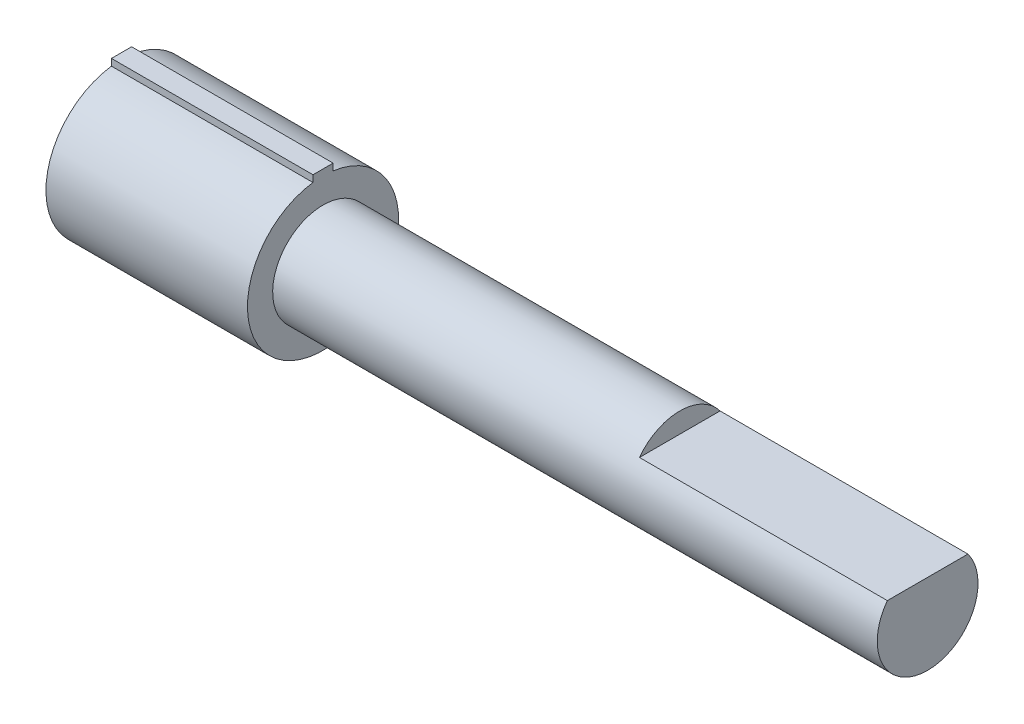
ISO-10303-21;
HEADER;
FILE_DESCRIPTION(('STEP AP214'),'2;1');
FILE_NAME('part.step','',(''),(''),'','','');
FILE_SCHEMA(('AUTOMOTIVE_DESIGN { 1 0 10303 214 1 1 1 1 }'));
ENDSEC;
DATA;
#1=APPLICATION_CONTEXT('core data for automotive mechanical design processes');
#2=APPLICATION_PROTOCOL_DEFINITION('international standard','automotive_design',2000,#1);
#3=PRODUCT_CONTEXT('',#1,'mechanical');
#4=PRODUCT('Part','Part','',(#3));
#5=PRODUCT_RELATED_PRODUCT_CATEGORY('part','',(#4));
#6=PRODUCT_DEFINITION_FORMATION('','',#4);
#7=PRODUCT_DEFINITION_CONTEXT('part definition',#1,'design');
#8=PRODUCT_DEFINITION('design','',#6,#7);
#9=PRODUCT_DEFINITION_SHAPE('','',#8);
#10=(LENGTH_UNIT() NAMED_UNIT(*) SI_UNIT(.MILLI.,.METRE.));
#11=(NAMED_UNIT(*) PLANE_ANGLE_UNIT() SI_UNIT($,.RADIAN.));
#12=(NAMED_UNIT(*) SI_UNIT($,.STERADIAN.) SOLID_ANGLE_UNIT());
#13=UNCERTAINTY_MEASURE_WITH_UNIT(LENGTH_MEASURE(1.E-05),#10,'distance_accuracy_value','');
#14=(GEOMETRIC_REPRESENTATION_CONTEXT(3) GLOBAL_UNCERTAINTY_ASSIGNED_CONTEXT((#13)) GLOBAL_UNIT_ASSIGNED_CONTEXT((#10,
#11,#12)) REPRESENTATION_CONTEXT('',''));
#15=CARTESIAN_POINT('',(0.,0.,0.));
#16=DIRECTION('',(0.,0.,1.));
#17=DIRECTION('',(1.,0.,0.));
#18=AXIS2_PLACEMENT_3D('',#15,#16,#17);
#19=CARTESIAN_POINT('',(12.7,0.,0.));
#20=DIRECTION('',(-1.,0.,0.));
#21=DIRECTION('',(0.,0.,1.));
#22=AXIS2_PLACEMENT_3D('',#19,#20,#21);
#23=CYLINDRICAL_SURFACE('',#22,4.7625);
#24=CARTESIAN_POINT('',(0.,0.,0.));
#25=DIRECTION('',(1.,0.,0.));
#26=DIRECTION('',(0.,0.,-1.));
#27=AXIS2_PLACEMENT_3D('',#24,#25,#26);
#28=CIRCLE('',#27,4.7625);
#29=CARTESIAN_POINT('',(0.,4.71997682727363,0.635));
#30=VERTEX_POINT('',#29);
#31=CARTESIAN_POINT('',(0.,4.71997682727363,-0.635));
#32=VERTEX_POINT('',#31);
#33=EDGE_CURVE('E45',#30,#32,#28,.T.);
#34=ORIENTED_EDGE('',*,*,#33,.T.);
#35=DIRECTION('',(-1.,0.,0.));
#36=VECTOR('',#35,1.);
#37=CARTESIAN_POINT('',(12.7,4.71997682727363,-0.635));
#38=LINE('',#37,#36);
#39=CARTESIAN_POINT('',(12.7,4.71997682727363,-0.635));
#40=VERTEX_POINT('',#39);
#41=EDGE_CURVE('E152',#32,#40,#38,.F.);
#42=ORIENTED_EDGE('',*,*,#41,.T.);
#43=CARTESIAN_POINT('',(12.7,0.,0.));
#44=DIRECTION('',(1.,0.,0.));
#45=DIRECTION('',(0.,0.,-1.));
#46=AXIS2_PLACEMENT_3D('',#43,#44,#45);
#47=CIRCLE('',#46,4.7625);
#48=CARTESIAN_POINT('',(12.7,4.71997682727363,0.635));
#49=VERTEX_POINT('',#48);
#50=EDGE_CURVE('E51',#49,#40,#47,.T.);
#51=ORIENTED_EDGE('',*,*,#50,.F.);
#52=DIRECTION('',(-1.,0.,0.));
#53=VECTOR('',#52,1.);
#54=CARTESIAN_POINT('',(12.7,4.71997682727363,0.635));
#55=LINE('',#54,#53);
#56=EDGE_CURVE('E149',#49,#30,#55,.T.);
#57=ORIENTED_EDGE('',*,*,#56,.T.);
#58=EDGE_LOOP('',(#34,#42,#51,#57));
#59=FACE_BOUND('',#58,.T.);
#60=ADVANCED_FACE('F42',(#59),#23,.T.);
#61=CARTESIAN_POINT('',(12.7,0.,0.));
#62=DIRECTION('',(1.,0.,0.));
#63=DIRECTION('',(0.,0.,-1.));
#64=AXIS2_PLACEMENT_3D('',#61,#62,#63);
#65=PLANE('',#64);
#66=ORIENTED_EDGE('',*,*,#50,.T.);
#67=DIRECTION('',(0.,1.,0.));
#68=VECTOR('',#67,1.);
#69=CARTESIAN_POINT('',(12.7,4.3815,-0.635));
#70=LINE('',#69,#68);
#71=CARTESIAN_POINT('',(12.7,5.1435,-0.635));
#72=VERTEX_POINT('',#71);
#73=EDGE_CURVE('E118',#40,#72,#70,.T.);
#74=ORIENTED_EDGE('',*,*,#73,.T.);
#75=DIRECTION('',(0.,0.,1.));
#76=VECTOR('',#75,1.);
#77=CARTESIAN_POINT('',(12.7,5.1435,0.635));
#78=LINE('',#77,#76);
#79=CARTESIAN_POINT('',(12.7,5.1435,0.635));
#80=VERTEX_POINT('',#79);
#81=EDGE_CURVE('E133',#72,#80,#78,.T.);
#82=ORIENTED_EDGE('',*,*,#81,.T.);
#83=DIRECTION('',(0.,-1.,0.));
#84=VECTOR('',#83,1.);
#85=CARTESIAN_POINT('',(12.7,4.3815,0.635));
#86=LINE('',#85,#84);
#87=EDGE_CURVE('E137',#80,#49,#86,.T.);
#88=ORIENTED_EDGE('',*,*,#87,.T.);
#89=EDGE_LOOP('',(#66,#74,#82,#88));
#90=FACE_BOUND('',#89,.T.);
#91=CARTESIAN_POINT('',(12.7,0.,0.));
#92=DIRECTION('',(1.,0.,0.));
#93=DIRECTION('',(0.,0.,-1.));
#94=AXIS2_PLACEMENT_3D('',#91,#92,#93);
#95=CIRCLE('',#94,3.175);
#96=CARTESIAN_POINT('',(12.7,0.,-3.175));
#97=VERTEX_POINT('',#96);
#98=EDGE_CURVE('E11',#97,#97,#95,.T.);
#99=ORIENTED_EDGE('',*,*,#98,.F.);
#100=EDGE_LOOP('',(#99));
#101=FACE_BOUND('',#100,.T.);
#102=ADVANCED_FACE('F183',(#90,#101),#65,.T.);
#103=CARTESIAN_POINT('',(0.,0.,0.));
#104=DIRECTION('',(1.,0.,0.));
#105=DIRECTION('',(0.,0.,-1.));
#106=AXIS2_PLACEMENT_3D('',#103,#104,#105);
#107=PLANE('',#106);
#108=ORIENTED_EDGE('',*,*,#33,.F.);
#109=DIRECTION('',(0.,1.,0.));
#110=VECTOR('',#109,1.);
#111=CARTESIAN_POINT('',(0.,4.3815,0.635));
#112=LINE('',#111,#110);
#113=CARTESIAN_POINT('',(0.,5.1435,0.635));
#114=VERTEX_POINT('',#113);
#115=EDGE_CURVE('E122',#30,#114,#112,.T.);
#116=ORIENTED_EDGE('',*,*,#115,.T.);
#117=DIRECTION('',(0.,0.,-1.));
#118=VECTOR('',#117,1.);
#119=CARTESIAN_POINT('',(0.,5.1435,0.635));
#120=LINE('',#119,#118);
#121=CARTESIAN_POINT('',(0.,5.1435,-0.635));
#122=VERTEX_POINT('',#121);
#123=EDGE_CURVE('E130',#114,#122,#120,.T.);
#124=ORIENTED_EDGE('',*,*,#123,.T.);
#125=DIRECTION('',(0.,-1.,0.));
#126=VECTOR('',#125,1.);
#127=CARTESIAN_POINT('',(0.,4.3815,-0.635));
#128=LINE('',#127,#126);
#129=EDGE_CURVE('E125',#122,#32,#128,.T.);
#130=ORIENTED_EDGE('',*,*,#129,.T.);
#131=EDGE_LOOP('',(#108,#116,#124,#130));
#132=FACE_BOUND('',#131,.T.);
#133=CARTESIAN_POINT('',(0.,0.,0.));
#134=DIRECTION('',(-1.,0.,0.));
#135=DIRECTION('',(0.,0.,1.));
#136=AXIS2_PLACEMENT_3D('',#133,#134,#135);
#137=CIRCLE('',#136,2.54);
#138=CARTESIAN_POINT('',(0.,0.,2.54));
#139=VERTEX_POINT('',#138);
#140=EDGE_CURVE('E156',#139,#139,#137,.T.);
#141=ORIENTED_EDGE('',*,*,#140,.F.);
#142=EDGE_LOOP('',(#141));
#143=FACE_BOUND('',#142,.T.);
#144=ADVANCED_FACE('F175',(#132,#143),#107,.F.);
#145=CARTESIAN_POINT('',(9.525,0.,0.));
#146=DIRECTION('',(-1.,0.,0.));
#147=DIRECTION('',(0.,0.,1.));
#148=AXIS2_PLACEMENT_3D('',#145,#146,#147);
#149=CYLINDRICAL_SURFACE('',#148,2.54);
#150=CARTESIAN_POINT('',(9.525,0.,0.));
#151=DIRECTION('',(-1.,0.,0.));
#152=DIRECTION('',(0.,0.,1.));
#153=AXIS2_PLACEMENT_3D('',#150,#151,#152);
#154=CIRCLE('',#153,2.54);
#155=CARTESIAN_POINT('',(9.525,0.,2.54));
#156=VERTEX_POINT('',#155);
#157=EDGE_CURVE('E158',#156,#156,#154,.T.);
#158=CARTESIAN_POINT('',(9.525,0.,2.54));
#159=CARTESIAN_POINT('',(9.42578125,0.,2.54));
#160=CARTESIAN_POINT('',(9.3265625,0.,2.54));
#161=CARTESIAN_POINT('',(9.128125,0.,2.54));
#162=CARTESIAN_POINT('',(9.02890625,0.,2.54));
#163=CARTESIAN_POINT('',(8.83046875,0.,2.54));
#164=CARTESIAN_POINT('',(8.73125,0.,2.54));
#165=CARTESIAN_POINT('',(8.5328125,0.,2.54));
#166=CARTESIAN_POINT('',(8.43359375,0.,2.54));
#167=CARTESIAN_POINT('',(8.23515625,0.,2.54));
#168=CARTESIAN_POINT('',(8.1359375,0.,2.54));
#169=CARTESIAN_POINT('',(7.9375,0.,2.54));
#170=CARTESIAN_POINT('',(7.83828125,0.,2.54));
#171=CARTESIAN_POINT('',(7.63984375,0.,2.54));
#172=CARTESIAN_POINT('',(7.540625,0.,2.54));
#173=CARTESIAN_POINT('',(7.3421875,0.,2.54));
#174=CARTESIAN_POINT('',(7.24296875,0.,2.54));
#175=CARTESIAN_POINT('',(7.04453125,0.,2.54));
#176=CARTESIAN_POINT('',(6.9453125,0.,2.54));
#177=CARTESIAN_POINT('',(6.746875,0.,2.54));
#178=CARTESIAN_POINT('',(6.64765625,0.,2.54));
#179=CARTESIAN_POINT('',(6.44921875,0.,2.54));
#180=CARTESIAN_POINT('',(6.35,0.,2.54));
#181=CARTESIAN_POINT('',(6.1515625,0.,2.54));
#182=CARTESIAN_POINT('',(6.05234375,0.,2.54));
#183=CARTESIAN_POINT('',(5.85390625,0.,2.54));
#184=CARTESIAN_POINT('',(5.7546875,0.,2.54));
#185=CARTESIAN_POINT('',(5.55625,0.,2.54));
#186=CARTESIAN_POINT('',(5.45703125,0.,2.54));
#187=CARTESIAN_POINT('',(5.25859375,0.,2.54));
#188=CARTESIAN_POINT('',(5.159375,0.,2.54));
#189=CARTESIAN_POINT('',(4.9609375,0.,2.54));
#190=CARTESIAN_POINT('',(4.86171875,0.,2.54));
#191=CARTESIAN_POINT('',(4.66328125,0.,2.54));
#192=CARTESIAN_POINT('',(4.5640625,0.,2.54));
#193=CARTESIAN_POINT('',(4.365625,0.,2.54));
#194=CARTESIAN_POINT('',(4.26640625,0.,2.54));
#195=CARTESIAN_POINT('',(4.06796875,0.,2.54));
#196=CARTESIAN_POINT('',(3.96875,0.,2.54));
#197=CARTESIAN_POINT('',(3.7703125,0.,2.54));
#198=CARTESIAN_POINT('',(3.67109375,0.,2.54));
#199=CARTESIAN_POINT('',(3.47265625,0.,2.54));
#200=CARTESIAN_POINT('',(3.3734375,0.,2.54));
#201=CARTESIAN_POINT('',(3.175,0.,2.54));
#202=CARTESIAN_POINT('',(3.07578125,0.,2.54));
#203=CARTESIAN_POINT('',(2.87734375,0.,2.54));
#204=CARTESIAN_POINT('',(2.778125,0.,2.54));
#205=CARTESIAN_POINT('',(2.5796875,0.,2.54));
#206=CARTESIAN_POINT('',(2.48046875,0.,2.54));
#207=CARTESIAN_POINT('',(2.28203125,0.,2.54));
#208=CARTESIAN_POINT('',(2.1828125,0.,2.54));
#209=CARTESIAN_POINT('',(1.984375,0.,2.54));
#210=CARTESIAN_POINT('',(1.88515625,0.,2.54));
#211=CARTESIAN_POINT('',(1.68671875,0.,2.54));
#212=CARTESIAN_POINT('',(1.5875,0.,2.54));
#213=CARTESIAN_POINT('',(1.3890625,0.,2.54));
#214=CARTESIAN_POINT('',(1.28984375,0.,2.54));
#215=CARTESIAN_POINT('',(1.09140625,0.,2.54));
#216=CARTESIAN_POINT('',(0.992187500000001,0.,2.54));
#217=CARTESIAN_POINT('',(0.793750000000001,0.,2.54));
#218=CARTESIAN_POINT('',(0.69453125,0.,2.54));
#219=CARTESIAN_POINT('',(0.49609375,0.,2.54));
#220=CARTESIAN_POINT('',(0.396875,0.,2.54));
#221=CARTESIAN_POINT('',(0.1984375,0.,2.54));
#222=CARTESIAN_POINT('',(0.0992187500000001,0.,2.54));
#223=CARTESIAN_POINT('',(0.,0.,2.54));
#224=B_SPLINE_CURVE_WITH_KNOTS('',3,(#158,#159,#160,#161,#162,#163,#164,#165,#166,#167,#168,
#169,#170,#171,#172,#173,#174,#175,#176,#177,#178,#179,#180,#181,#182,#183,#184,#185,#186,#187,
#188,#189,#190,#191,#192,#193,#194,#195,#196,#197,#198,#199,#200,#201,#202,#203,#204,#205,#206,
#207,#208,#209,#210,#211,#212,#213,#214,#215,#216,#217,#218,#219,#220,#221,#222,#223),
.UNSPECIFIED.,.F.,.F.,(4,2,2,2,2,2,2,2,2,2,2,2,2,2,2,2,2,2,2,2,2,2,2,2,2,2,2,2,2,2,2,2,4),(0.,
0.29765625,0.5953125,0.892968750000001,1.190625,1.48828125,1.7859375,2.08359375,2.38125,
2.67890625,2.9765625,3.27421875,3.571875,3.86953125,4.1671875,4.46484375,4.7625,5.06015625,
5.3578125,5.65546875,5.953125,6.25078125,6.5484375,6.84609375,7.14375,7.44140625,7.7390625,
8.03671875,8.334375,8.63203125,8.9296875,9.22734375,9.525),.UNSPECIFIED.);
#225=EDGE_CURVE('BSEAM205',#156,#139,#224,.T.);
#226=ORIENTED_EDGE('',*,*,#157,.F.);
#227=ORIENTED_EDGE('',*,*,#140,.T.);
#228=ORIENTED_EDGE('',*,*,#225,.T.);
#229=ORIENTED_EDGE('',*,*,#225,.F.);
#230=EDGE_LOOP('',(#226,#228,#227,#229));
#231=FACE_BOUND('',#230,.T.);
#232=ADVANCED_FACE('F205',(#231),#149,.F.);
#233=CARTESIAN_POINT('',(9.525,0.,0.));
#234=DIRECTION('',(-1.,0.,0.));
#235=DIRECTION('',(0.,0.,1.));
#236=AXIS2_PLACEMENT_3D('',#233,#234,#235);
#237=PLANE('',#236);
#238=ORIENTED_EDGE('',*,*,#157,.T.);
#239=EDGE_LOOP('',(#238));
#240=FACE_BOUND('',#239,.T.);
#241=ADVANCED_FACE('F209',(#240),#237,.T.);
#242=CARTESIAN_POINT('',(50.8,0.,0.));
#243=DIRECTION('',(-1.,0.,0.));
#244=DIRECTION('',(0.,0.,1.));
#245=AXIS2_PLACEMENT_3D('',#242,#243,#244);
#246=CYLINDRICAL_SURFACE('',#245,3.175);
#247=CARTESIAN_POINT('',(50.8,0.,0.));
#248=DIRECTION('',(1.,0.,0.));
#249=DIRECTION('',(0.,0.,-1.));
#250=AXIS2_PLACEMENT_3D('',#247,#248,#249);
#251=CIRCLE('',#250,3.175);
#252=CARTESIAN_POINT('',(50.8,1.905,2.54));
#253=VERTEX_POINT('',#252);
#254=CARTESIAN_POINT('',(50.8,1.905,-2.54));
#255=VERTEX_POINT('',#254);
#256=EDGE_CURVE('E114',#253,#255,#251,.T.);
#257=ORIENTED_EDGE('',*,*,#256,.F.);
#258=DIRECTION('',(1.,0.,0.));
#259=VECTOR('',#258,1.);
#260=CARTESIAN_POINT('',(35.179,1.905,2.54));
#261=LINE('',#260,#259);
#262=CARTESIAN_POINT('',(35.179,1.905,2.54));
#263=VERTEX_POINT('',#262);
#264=EDGE_CURVE('E59',#263,#253,#261,.T.);
#265=ORIENTED_EDGE('',*,*,#264,.F.);
#266=CARTESIAN_POINT('',(35.179,0.,0.));
#267=DIRECTION('',(1.,0.,0.));
#268=DIRECTION('',(0.,0.,1.));
#269=AXIS2_PLACEMENT_3D('',#266,#267,#268);
#270=CIRCLE('',#269,3.175);
#271=CARTESIAN_POINT('',(35.179,1.905,-2.54));
#272=VERTEX_POINT('',#271);
#273=EDGE_CURVE('E98',#272,#263,#270,.T.);
#274=ORIENTED_EDGE('',*,*,#273,.F.);
#275=DIRECTION('',(1.,0.,0.));
#276=VECTOR('',#275,1.);
#277=CARTESIAN_POINT('',(35.179,1.905,-2.54));
#278=LINE('',#277,#276);
#279=EDGE_CURVE('E107',#272,#255,#278,.T.);
#280=ORIENTED_EDGE('',*,*,#279,.T.);
#281=EDGE_LOOP('',(#257,#265,#274,#280));
#282=FACE_BOUND('',#281,.T.);
#283=ORIENTED_EDGE('',*,*,#98,.T.);
#284=EDGE_LOOP('',(#283));
#285=FACE_BOUND('',#284,.T.);
#286=ADVANCED_FACE('F111',(#282,#285),#246,.T.);
#287=CARTESIAN_POINT('',(50.8,0.,0.));
#288=DIRECTION('',(1.,0.,0.));
#289=DIRECTION('',(0.,0.,-1.));
#290=AXIS2_PLACEMENT_3D('',#287,#288,#289);
#291=PLANE('',#290);
#292=DIRECTION('',(0.,0.,-1.));
#293=VECTOR('',#292,1.);
#294=CARTESIAN_POINT('',(50.8,1.905,2.54));
#295=LINE('',#294,#293);
#296=EDGE_CURVE('E104',#253,#255,#295,.T.);
#297=ORIENTED_EDGE('',*,*,#296,.F.);
#298=ORIENTED_EDGE('',*,*,#256,.T.);
#299=EDGE_LOOP('',(#297,#298));
#300=FACE_BOUND('',#299,.T.);
#301=ADVANCED_FACE('F194',(#300),#291,.T.);
#302=CARTESIAN_POINT('',(-1.4810617812907,4.3815,-0.635));
#303=DIRECTION('',(0.,0.,-1.));
#304=DIRECTION('',(-1.,0.,0.));
#305=AXIS2_PLACEMENT_3D('',#302,#303,#304);
#306=PLANE('',#305);
#307=ORIENTED_EDGE('',*,*,#41,.F.);
#308=ORIENTED_EDGE('',*,*,#129,.F.);
#309=DIRECTION('',(1.,0.,0.));
#310=VECTOR('',#309,1.);
#311=CARTESIAN_POINT('',(-1.4810617812907,5.1435,-0.635));
#312=LINE('',#311,#310);
#313=EDGE_CURVE('E141',#122,#72,#312,.T.);
#314=ORIENTED_EDGE('',*,*,#313,.T.);
#315=ORIENTED_EDGE('',*,*,#73,.F.);
#316=EDGE_LOOP('',(#307,#308,#314,#315));
#317=FACE_BOUND('',#316,.T.);
#318=ADVANCED_FACE('F173',(#317),#306,.T.);
#319=CARTESIAN_POINT('',(-1.4810617812907,4.3815,0.635));
#320=DIRECTION('',(0.,0.,1.));
#321=DIRECTION('',(1.,0.,0.));
#322=AXIS2_PLACEMENT_3D('',#319,#320,#321);
#323=PLANE('',#322);
#324=ORIENTED_EDGE('',*,*,#56,.F.);
#325=ORIENTED_EDGE('',*,*,#87,.F.);
#326=DIRECTION('',(1.,0.,0.));
#327=VECTOR('',#326,1.);
#328=CARTESIAN_POINT('',(-1.4810617812907,5.1435,0.635));
#329=LINE('',#328,#327);
#330=EDGE_CURVE('E126',#114,#80,#329,.T.);
#331=ORIENTED_EDGE('',*,*,#330,.F.);
#332=ORIENTED_EDGE('',*,*,#115,.F.);
#333=EDGE_LOOP('',(#324,#325,#331,#332));
#334=FACE_BOUND('',#333,.T.);
#335=ADVANCED_FACE('F186',(#334),#323,.T.);
#336=CARTESIAN_POINT('',(-1.4810617812907,5.1435,0.635));
#337=DIRECTION('',(0.,1.,0.));
#338=DIRECTION('',(0.,0.,1.));
#339=AXIS2_PLACEMENT_3D('',#336,#337,#338);
#340=PLANE('',#339);
#341=ORIENTED_EDGE('',*,*,#123,.F.);
#342=ORIENTED_EDGE('',*,*,#330,.T.);
#343=ORIENTED_EDGE('',*,*,#81,.F.);
#344=ORIENTED_EDGE('',*,*,#313,.F.);
#345=EDGE_LOOP('',(#341,#342,#343,#344));
#346=FACE_BOUND('',#345,.T.);
#347=ADVANCED_FACE('F180',(#346),#340,.T.);
#348=CARTESIAN_POINT('',(35.179,1.905,2.54));
#349=DIRECTION('',(0.,-1.,0.));
#350=DIRECTION('',(0.,0.,-1.));
#351=AXIS2_PLACEMENT_3D('',#348,#349,#350);
#352=PLANE('',#351);
#353=ORIENTED_EDGE('',*,*,#296,.T.);
#354=ORIENTED_EDGE('',*,*,#279,.F.);
#355=DIRECTION('',(0.,0.,-1.));
#356=VECTOR('',#355,1.);
#357=CARTESIAN_POINT('',(35.179,1.905,2.54));
#358=LINE('',#357,#356);
#359=EDGE_CURVE('E100',#263,#272,#358,.T.);
#360=ORIENTED_EDGE('',*,*,#359,.F.);
#361=ORIENTED_EDGE('',*,*,#264,.T.);
#362=EDGE_LOOP('',(#353,#354,#360,#361));
#363=FACE_BOUND('',#362,.T.);
#364=ADVANCED_FACE('F106',(#363),#352,.F.);
#365=CARTESIAN_POINT('',(35.179,0.,0.));
#366=DIRECTION('',(-1.,0.,0.));
#367=DIRECTION('',(0.,0.,1.));
#368=AXIS2_PLACEMENT_3D('',#365,#366,#367);
#369=PLANE('',#368);
#370=ORIENTED_EDGE('',*,*,#273,.T.);
#371=ORIENTED_EDGE('',*,*,#359,.T.);
#372=EDGE_LOOP('',(#370,#371));
#373=FACE_BOUND('',#372,.T.);
#374=ADVANCED_FACE('F99',(#373),#369,.F.);
#375=CLOSED_SHELL('',(#60,#102,#144,#232,#241,#286,#301,#318,#335,#347,#364,#374));
#376=MANIFOLD_SOLID_BREP('B2',#375);
#377=ADVANCED_BREP_SHAPE_REPRESENTATION('',(#18,#376),#14);
#378=SHAPE_DEFINITION_REPRESENTATION(#9,#377);
ENDSEC;
END-ISO-10303-21;
